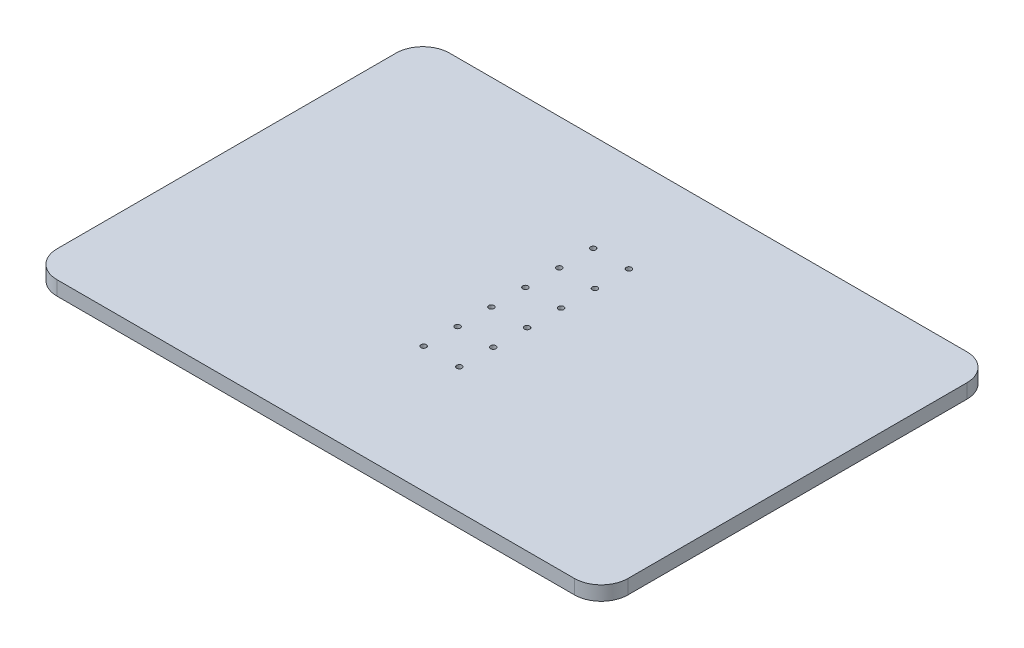
ISO-10303-21;
HEADER;
FILE_DESCRIPTION(('STEP AP214'),'2;1');
FILE_NAME('part.step','',(''),(''),'','','');
FILE_SCHEMA(('AUTOMOTIVE_DESIGN { 1 0 10303 214 1 1 1 1 }'));
ENDSEC;
DATA;
#1=APPLICATION_CONTEXT('core data for automotive mechanical design processes');
#2=APPLICATION_PROTOCOL_DEFINITION('international standard','automotive_design',2000,#1);
#3=PRODUCT_CONTEXT('',#1,'mechanical');
#4=PRODUCT('Part','Part','',(#3));
#5=PRODUCT_RELATED_PRODUCT_CATEGORY('part','',(#4));
#6=PRODUCT_DEFINITION_FORMATION('','',#4);
#7=PRODUCT_DEFINITION_CONTEXT('part definition',#1,'design');
#8=PRODUCT_DEFINITION('design','',#6,#7);
#9=PRODUCT_DEFINITION_SHAPE('','',#8);
#10=(LENGTH_UNIT() NAMED_UNIT(*) SI_UNIT(.MILLI.,.METRE.));
#11=(NAMED_UNIT(*) PLANE_ANGLE_UNIT() SI_UNIT($,.RADIAN.));
#12=(NAMED_UNIT(*) SI_UNIT($,.STERADIAN.) SOLID_ANGLE_UNIT());
#13=UNCERTAINTY_MEASURE_WITH_UNIT(LENGTH_MEASURE(1.E-05),#10,'distance_accuracy_value','');
#14=(GEOMETRIC_REPRESENTATION_CONTEXT(3) GLOBAL_UNCERTAINTY_ASSIGNED_CONTEXT((#13)) GLOBAL_UNIT_ASSIGNED_CONTEXT((#10,
#11,#12)) REPRESENTATION_CONTEXT('',''));
#15=CARTESIAN_POINT('',(0.,0.,0.));
#16=DIRECTION('',(0.,0.,1.));
#17=DIRECTION('',(1.,0.,0.));
#18=AXIS2_PLACEMENT_3D('',#15,#16,#17);
#19=CARTESIAN_POINT('',(-160.,8.,-110.));
#20=DIRECTION('',(1.,0.,0.));
#21=DIRECTION('',(0.,0.,-1.));
#22=AXIS2_PLACEMENT_3D('',#19,#20,#21);
#23=PLANE('',#22);
#24=DIRECTION('',(0.,0.,1.));
#25=VECTOR('',#24,1.);
#26=CARTESIAN_POINT('',(-160.,8.,-110.));
#27=LINE('',#26,#25);
#28=CARTESIAN_POINT('',(-160.,8.,-95.));
#29=VERTEX_POINT('',#28);
#30=CARTESIAN_POINT('',(-160.,8.,95.0000000000001));
#31=VERTEX_POINT('',#30);
#32=EDGE_CURVE('E117',#29,#31,#27,.T.);
#33=ORIENTED_EDGE('',*,*,#32,.F.);
#34=DIRECTION('',(0.,-1.,0.));
#35=VECTOR('',#34,1.);
#36=CARTESIAN_POINT('',(-160.,8.,-95.));
#37=LINE('',#36,#35);
#38=CARTESIAN_POINT('',(-160.,0.,-95.));
#39=VERTEX_POINT('',#38);
#40=EDGE_CURVE('E102',#29,#39,#37,.T.);
#41=ORIENTED_EDGE('',*,*,#40,.T.);
#42=DIRECTION('',(0.,0.,1.));
#43=VECTOR('',#42,1.);
#44=CARTESIAN_POINT('',(-160.,0.,-110.));
#45=LINE('',#44,#43);
#46=CARTESIAN_POINT('',(-160.,0.,95.0000000000001));
#47=VERTEX_POINT('',#46);
#48=EDGE_CURVE('E114',#39,#47,#45,.T.);
#49=ORIENTED_EDGE('',*,*,#48,.T.);
#50=DIRECTION('',(0.,-1.,0.));
#51=VECTOR('',#50,1.);
#52=CARTESIAN_POINT('',(-160.,8.,95.0000000000001));
#53=LINE('',#52,#51);
#54=EDGE_CURVE('E119',#47,#31,#53,.F.);
#55=ORIENTED_EDGE('',*,*,#54,.T.);
#56=EDGE_LOOP('',(#33,#41,#49,#55));
#57=FACE_BOUND('',#56,.T.);
#58=ADVANCED_FACE('F32',(#57),#23,.F.);
#59=CARTESIAN_POINT('',(160.,8.,110.));
#60=DIRECTION('',(0.,0.,-1.));
#61=DIRECTION('',(-1.,0.,0.));
#62=AXIS2_PLACEMENT_3D('',#59,#60,#61);
#63=PLANE('',#62);
#64=DIRECTION('',(1.,0.,0.));
#65=VECTOR('',#64,1.);
#66=CARTESIAN_POINT('',(160.,8.,110.));
#67=LINE('',#66,#65);
#68=CARTESIAN_POINT('',(-145.,8.,110.));
#69=VERTEX_POINT('',#68);
#70=CARTESIAN_POINT('',(145.,8.,110.));
#71=VERTEX_POINT('',#70);
#72=EDGE_CURVE('E163',#69,#71,#67,.T.);
#73=ORIENTED_EDGE('',*,*,#72,.F.);
#74=DIRECTION('',(0.,-1.,0.));
#75=VECTOR('',#74,1.);
#76=CARTESIAN_POINT('',(-145.,8.,110.));
#77=LINE('',#76,#75);
#78=CARTESIAN_POINT('',(-145.,0.,110.));
#79=VERTEX_POINT('',#78);
#80=EDGE_CURVE('E156',#69,#79,#77,.T.);
#81=ORIENTED_EDGE('',*,*,#80,.T.);
#82=DIRECTION('',(1.,0.,0.));
#83=VECTOR('',#82,1.);
#84=CARTESIAN_POINT('',(160.,0.,110.));
#85=LINE('',#84,#83);
#86=CARTESIAN_POINT('',(145.,0.,110.));
#87=VERTEX_POINT('',#86);
#88=EDGE_CURVE('E123',#79,#87,#85,.T.);
#89=ORIENTED_EDGE('',*,*,#88,.T.);
#90=DIRECTION('',(0.,-1.,0.));
#91=VECTOR('',#90,1.);
#92=CARTESIAN_POINT('',(145.,8.,110.));
#93=LINE('',#92,#91);
#94=EDGE_CURVE('E154',#87,#71,#93,.F.);
#95=ORIENTED_EDGE('',*,*,#94,.T.);
#96=EDGE_LOOP('',(#73,#81,#89,#95));
#97=FACE_BOUND('',#96,.T.);
#98=ADVANCED_FACE('F161',(#97),#63,.F.);
#99=CARTESIAN_POINT('',(160.,8.,-110.));
#100=DIRECTION('',(-1.,0.,0.));
#101=DIRECTION('',(0.,0.,1.));
#102=AXIS2_PLACEMENT_3D('',#99,#100,#101);
#103=PLANE('',#102);
#104=DIRECTION('',(0.,0.,-1.));
#105=VECTOR('',#104,1.);
#106=CARTESIAN_POINT('',(160.,8.,-110.));
#107=LINE('',#106,#105);
#108=CARTESIAN_POINT('',(160.,8.,95.));
#109=VERTEX_POINT('',#108);
#110=CARTESIAN_POINT('',(160.,8.,-95.));
#111=VERTEX_POINT('',#110);
#112=EDGE_CURVE('E171',#109,#111,#107,.T.);
#113=ORIENTED_EDGE('',*,*,#112,.F.);
#114=DIRECTION('',(0.,-1.,0.));
#115=VECTOR('',#114,1.);
#116=CARTESIAN_POINT('',(160.,8.,95.));
#117=LINE('',#116,#115);
#118=CARTESIAN_POINT('',(160.,0.,95.));
#119=VERTEX_POINT('',#118);
#120=EDGE_CURVE('E11',#109,#119,#117,.T.);
#121=ORIENTED_EDGE('',*,*,#120,.T.);
#122=DIRECTION('',(0.,0.,-1.));
#123=VECTOR('',#122,1.);
#124=CARTESIAN_POINT('',(160.,0.,-110.));
#125=LINE('',#124,#123);
#126=CARTESIAN_POINT('',(160.,0.,-95.));
#127=VERTEX_POINT('',#126);
#128=EDGE_CURVE('E127',#119,#127,#125,.T.);
#129=ORIENTED_EDGE('',*,*,#128,.T.);
#130=DIRECTION('',(0.,-1.,0.));
#131=VECTOR('',#130,1.);
#132=CARTESIAN_POINT('',(160.,8.,-95.));
#133=LINE('',#132,#131);
#134=EDGE_CURVE('E40',#127,#111,#133,.F.);
#135=ORIENTED_EDGE('',*,*,#134,.T.);
#136=EDGE_LOOP('',(#113,#121,#129,#135));
#137=FACE_BOUND('',#136,.T.);
#138=ADVANCED_FACE('F170',(#137),#103,.F.);
#139=CARTESIAN_POINT('',(160.,8.,-110.));
#140=DIRECTION('',(0.,0.,1.));
#141=DIRECTION('',(1.,0.,0.));
#142=AXIS2_PLACEMENT_3D('',#139,#140,#141);
#143=PLANE('',#142);
#144=DIRECTION('',(-1.,0.,0.));
#145=VECTOR('',#144,1.);
#146=CARTESIAN_POINT('',(160.,0.,-110.));
#147=LINE('',#146,#145);
#148=CARTESIAN_POINT('',(145.,0.,-110.));
#149=VERTEX_POINT('',#148);
#150=CARTESIAN_POINT('',(-145.,0.,-110.));
#151=VERTEX_POINT('',#150);
#152=EDGE_CURVE('E137',#149,#151,#147,.T.);
#153=ORIENTED_EDGE('',*,*,#152,.T.);
#154=DIRECTION('',(0.,-1.,0.));
#155=VECTOR('',#154,1.);
#156=CARTESIAN_POINT('',(-145.,8.,-110.));
#157=LINE('',#156,#155);
#158=CARTESIAN_POINT('',(-145.,8.,-110.));
#159=VERTEX_POINT('',#158);
#160=EDGE_CURVE('E103',#151,#159,#157,.F.);
#161=ORIENTED_EDGE('',*,*,#160,.T.);
#162=DIRECTION('',(-1.,0.,0.));
#163=VECTOR('',#162,1.);
#164=CARTESIAN_POINT('',(160.,8.,-110.));
#165=LINE('',#164,#163);
#166=CARTESIAN_POINT('',(145.,8.,-110.));
#167=VERTEX_POINT('',#166);
#168=EDGE_CURVE('E133',#167,#159,#165,.T.);
#169=ORIENTED_EDGE('',*,*,#168,.F.);
#170=DIRECTION('',(0.,-1.,0.));
#171=VECTOR('',#170,1.);
#172=CARTESIAN_POINT('',(145.,8.,-110.));
#173=LINE('',#172,#171);
#174=EDGE_CURVE('E108',#167,#149,#173,.T.);
#175=ORIENTED_EDGE('',*,*,#174,.T.);
#176=EDGE_LOOP('',(#153,#161,#169,#175));
#177=FACE_BOUND('',#176,.T.);
#178=ADVANCED_FACE('F283',(#177),#143,.F.);
#179=CARTESIAN_POINT('',(0.,8.,0.));
#180=DIRECTION('',(0.,-1.,0.));
#181=DIRECTION('',(0.,0.,-1.));
#182=AXIS2_PLACEMENT_3D('',#179,#180,#181);
#183=PLANE('',#182);
#184=CARTESIAN_POINT('',(10.,8.,-55.5));
#185=DIRECTION('',(0.,-1.,0.));
#186=DIRECTION('',(0.,0.,1.));
#187=AXIS2_PLACEMENT_3D('',#184,#185,#186);
#188=CIRCLE('',#187,1.5);
#189=CARTESIAN_POINT('',(10.,8.,-54.));
#190=VERTEX_POINT('',#189);
#191=EDGE_CURVE('E239',#190,#190,#188,.T.);
#192=ORIENTED_EDGE('',*,*,#191,.T.);
#193=EDGE_LOOP('',(#192));
#194=FACE_BOUND('',#193,.T.);
#195=CARTESIAN_POINT('',(10.,8.,-36.5));
#196=DIRECTION('',(0.,-1.,0.));
#197=DIRECTION('',(0.,0.,1.));
#198=AXIS2_PLACEMENT_3D('',#195,#196,#197);
#199=CIRCLE('',#198,1.5);
#200=CARTESIAN_POINT('',(10.,8.,-35.));
#201=VERTEX_POINT('',#200);
#202=EDGE_CURVE('E233',#201,#201,#199,.T.);
#203=ORIENTED_EDGE('',*,*,#202,.T.);
#204=EDGE_LOOP('',(#203));
#205=FACE_BOUND('',#204,.T.);
#206=CARTESIAN_POINT('',(10.,8.,-17.5));
#207=DIRECTION('',(0.,-1.,0.));
#208=DIRECTION('',(0.,0.,1.));
#209=AXIS2_PLACEMENT_3D('',#206,#207,#208);
#210=CIRCLE('',#209,1.5);
#211=CARTESIAN_POINT('',(10.,8.,-16.));
#212=VERTEX_POINT('',#211);
#213=EDGE_CURVE('E227',#212,#212,#210,.T.);
#214=ORIENTED_EDGE('',*,*,#213,.T.);
#215=EDGE_LOOP('',(#214));
#216=FACE_BOUND('',#215,.T.);
#217=CARTESIAN_POINT('',(10.,8.,39.5));
#218=DIRECTION('',(0.,-1.,0.));
#219=DIRECTION('',(0.,0.,1.));
#220=AXIS2_PLACEMENT_3D('',#217,#218,#219);
#221=CIRCLE('',#220,1.5);
#222=CARTESIAN_POINT('',(10.,8.,41.));
#223=VERTEX_POINT('',#222);
#224=EDGE_CURVE('E221',#223,#223,#221,.T.);
#225=ORIENTED_EDGE('',*,*,#224,.T.);
#226=EDGE_LOOP('',(#225));
#227=FACE_BOUND('',#226,.T.);
#228=CARTESIAN_POINT('',(10.,8.,20.5));
#229=DIRECTION('',(0.,-1.,0.));
#230=DIRECTION('',(0.,0.,1.));
#231=AXIS2_PLACEMENT_3D('',#228,#229,#230);
#232=CIRCLE('',#231,1.5);
#233=CARTESIAN_POINT('',(10.,8.,22.));
#234=VERTEX_POINT('',#233);
#235=EDGE_CURVE('E215',#234,#234,#232,.T.);
#236=ORIENTED_EDGE('',*,*,#235,.T.);
#237=EDGE_LOOP('',(#236));
#238=FACE_BOUND('',#237,.T.);
#239=CARTESIAN_POINT('',(10.,8.,1.5));
#240=DIRECTION('',(0.,-1.,0.));
#241=DIRECTION('',(0.,0.,1.));
#242=AXIS2_PLACEMENT_3D('',#239,#240,#241);
#243=CIRCLE('',#242,1.5);
#244=CARTESIAN_POINT('',(10.,8.,3.));
#245=VERTEX_POINT('',#244);
#246=EDGE_CURVE('E209',#245,#245,#243,.T.);
#247=ORIENTED_EDGE('',*,*,#246,.T.);
#248=EDGE_LOOP('',(#247));
#249=FACE_BOUND('',#248,.T.);
#250=CARTESIAN_POINT('',(-10.,8.,39.5));
#251=DIRECTION('',(0.,1.,0.));
#252=DIRECTION('',(0.,0.,1.));
#253=AXIS2_PLACEMENT_3D('',#250,#251,#252);
#254=CIRCLE('',#253,1.5);
#255=CARTESIAN_POINT('',(-10.,8.,41.));
#256=VERTEX_POINT('',#255);
#257=EDGE_CURVE('E203',#256,#256,#254,.T.);
#258=ORIENTED_EDGE('',*,*,#257,.F.);
#259=EDGE_LOOP('',(#258));
#260=FACE_BOUND('',#259,.T.);
#261=CARTESIAN_POINT('',(-10.,8.,20.5));
#262=DIRECTION('',(0.,1.,0.));
#263=DIRECTION('',(0.,0.,1.));
#264=AXIS2_PLACEMENT_3D('',#261,#262,#263);
#265=CIRCLE('',#264,1.5);
#266=CARTESIAN_POINT('',(-10.,8.,22.));
#267=VERTEX_POINT('',#266);
#268=EDGE_CURVE('E197',#267,#267,#265,.T.);
#269=ORIENTED_EDGE('',*,*,#268,.F.);
#270=EDGE_LOOP('',(#269));
#271=FACE_BOUND('',#270,.T.);
#272=CARTESIAN_POINT('',(-10.,8.,-55.5));
#273=DIRECTION('',(0.,1.,0.));
#274=DIRECTION('',(0.,0.,1.));
#275=AXIS2_PLACEMENT_3D('',#272,#273,#274);
#276=CIRCLE('',#275,1.5);
#277=CARTESIAN_POINT('',(-10.,8.,-54.));
#278=VERTEX_POINT('',#277);
#279=EDGE_CURVE('E191',#278,#278,#276,.T.);
#280=ORIENTED_EDGE('',*,*,#279,.F.);
#281=EDGE_LOOP('',(#280));
#282=FACE_BOUND('',#281,.T.);
#283=CARTESIAN_POINT('',(-10.,8.,-36.5));
#284=DIRECTION('',(0.,1.,0.));
#285=DIRECTION('',(0.,0.,1.));
#286=AXIS2_PLACEMENT_3D('',#283,#284,#285);
#287=CIRCLE('',#286,1.5);
#288=CARTESIAN_POINT('',(-10.,8.,-35.));
#289=VERTEX_POINT('',#288);
#290=EDGE_CURVE('E185',#289,#289,#287,.T.);
#291=ORIENTED_EDGE('',*,*,#290,.F.);
#292=EDGE_LOOP('',(#291));
#293=FACE_BOUND('',#292,.T.);
#294=CARTESIAN_POINT('',(-10.,8.,-17.5));
#295=DIRECTION('',(0.,1.,0.));
#296=DIRECTION('',(0.,0.,1.));
#297=AXIS2_PLACEMENT_3D('',#294,#295,#296);
#298=CIRCLE('',#297,1.5);
#299=CARTESIAN_POINT('',(-10.,8.,-16.));
#300=VERTEX_POINT('',#299);
#301=EDGE_CURVE('E178',#300,#300,#298,.T.);
#302=ORIENTED_EDGE('',*,*,#301,.F.);
#303=EDGE_LOOP('',(#302));
#304=FACE_BOUND('',#303,.T.);
#305=CARTESIAN_POINT('',(-10.,8.,1.5));
#306=DIRECTION('',(0.,1.,0.));
#307=DIRECTION('',(0.,0.,1.));
#308=AXIS2_PLACEMENT_3D('',#305,#306,#307);
#309=CIRCLE('',#308,1.5);
#310=CARTESIAN_POINT('',(-10.,8.,3.));
#311=VERTEX_POINT('',#310);
#312=EDGE_CURVE('E124',#311,#311,#309,.T.);
#313=ORIENTED_EDGE('',*,*,#312,.F.);
#314=EDGE_LOOP('',(#313));
#315=FACE_BOUND('',#314,.T.);
#316=ORIENTED_EDGE('',*,*,#168,.T.);
#317=CARTESIAN_POINT('',(-145.,8.,-95.));
#318=DIRECTION('',(0.,-1.,0.));
#319=DIRECTION('',(0.,0.,-1.));
#320=AXIS2_PLACEMENT_3D('',#317,#318,#319);
#321=CIRCLE('',#320,15.);
#322=EDGE_CURVE('E152',#159,#29,#321,.F.);
#323=ORIENTED_EDGE('',*,*,#322,.T.);
#324=ORIENTED_EDGE('',*,*,#32,.T.);
#325=CARTESIAN_POINT('',(-145.,8.,95.));
#326=DIRECTION('',(0.,-1.,0.));
#327=DIRECTION('',(0.,0.,-1.));
#328=AXIS2_PLACEMENT_3D('',#325,#326,#327);
#329=CIRCLE('',#328,15.);
#330=EDGE_CURVE('E150',#31,#69,#329,.F.);
#331=ORIENTED_EDGE('',*,*,#330,.T.);
#332=ORIENTED_EDGE('',*,*,#72,.T.);
#333=CARTESIAN_POINT('',(145.,8.,95.));
#334=DIRECTION('',(0.,-1.,0.));
#335=DIRECTION('',(0.,0.,-1.));
#336=AXIS2_PLACEMENT_3D('',#333,#334,#335);
#337=CIRCLE('',#336,15.);
#338=EDGE_CURVE('E53',#71,#109,#337,.F.);
#339=ORIENTED_EDGE('',*,*,#338,.T.);
#340=ORIENTED_EDGE('',*,*,#112,.T.);
#341=CARTESIAN_POINT('',(145.,8.,-95.));
#342=DIRECTION('',(0.,-1.,0.));
#343=DIRECTION('',(0.,0.,-1.));
#344=AXIS2_PLACEMENT_3D('',#341,#342,#343);
#345=CIRCLE('',#344,15.);
#346=EDGE_CURVE('E147',#111,#167,#345,.F.);
#347=ORIENTED_EDGE('',*,*,#346,.T.);
#348=EDGE_LOOP('',(#316,#323,#324,#331,#332,#339,#340,#347));
#349=FACE_BOUND('',#348,.T.);
#350=ADVANCED_FACE('F251',(#194,#205,#216,#227,#238,#249,#260,#271,#282,#293,#304,#315,#349),
#183,.F.);
#351=CARTESIAN_POINT('',(0.,0.,0.));
#352=DIRECTION('',(0.,-1.,0.));
#353=DIRECTION('',(0.,0.,-1.));
#354=AXIS2_PLACEMENT_3D('',#351,#352,#353);
#355=PLANE('',#354);
#356=CARTESIAN_POINT('',(10.,0.,-55.5));
#357=DIRECTION('',(0.,1.,0.));
#358=DIRECTION('',(0.,0.,-1.));
#359=AXIS2_PLACEMENT_3D('',#356,#357,#358);
#360=CIRCLE('',#359,1.5);
#361=CARTESIAN_POINT('',(10.,0.,-57.));
#362=VERTEX_POINT('',#361);
#363=EDGE_CURVE('E242',#362,#362,#360,.F.);
#364=ORIENTED_EDGE('',*,*,#363,.F.);
#365=EDGE_LOOP('',(#364));
#366=FACE_BOUND('',#365,.T.);
#367=CARTESIAN_POINT('',(10.,0.,-36.5));
#368=DIRECTION('',(0.,1.,0.));
#369=DIRECTION('',(0.,0.,-1.));
#370=AXIS2_PLACEMENT_3D('',#367,#368,#369);
#371=CIRCLE('',#370,1.5);
#372=CARTESIAN_POINT('',(10.,0.,-38.));
#373=VERTEX_POINT('',#372);
#374=EDGE_CURVE('E236',#373,#373,#371,.F.);
#375=ORIENTED_EDGE('',*,*,#374,.F.);
#376=EDGE_LOOP('',(#375));
#377=FACE_BOUND('',#376,.T.);
#378=CARTESIAN_POINT('',(10.,0.,-17.5));
#379=DIRECTION('',(0.,1.,0.));
#380=DIRECTION('',(0.,0.,-1.));
#381=AXIS2_PLACEMENT_3D('',#378,#379,#380);
#382=CIRCLE('',#381,1.5);
#383=CARTESIAN_POINT('',(10.,0.,-19.));
#384=VERTEX_POINT('',#383);
#385=EDGE_CURVE('E230',#384,#384,#382,.F.);
#386=ORIENTED_EDGE('',*,*,#385,.F.);
#387=EDGE_LOOP('',(#386));
#388=FACE_BOUND('',#387,.T.);
#389=CARTESIAN_POINT('',(10.,0.,39.5));
#390=DIRECTION('',(0.,1.,0.));
#391=DIRECTION('',(0.,0.,-1.));
#392=AXIS2_PLACEMENT_3D('',#389,#390,#391);
#393=CIRCLE('',#392,1.5);
#394=CARTESIAN_POINT('',(10.,0.,38.));
#395=VERTEX_POINT('',#394);
#396=EDGE_CURVE('E224',#395,#395,#393,.F.);
#397=ORIENTED_EDGE('',*,*,#396,.F.);
#398=EDGE_LOOP('',(#397));
#399=FACE_BOUND('',#398,.T.);
#400=CARTESIAN_POINT('',(10.,0.,20.5));
#401=DIRECTION('',(0.,1.,0.));
#402=DIRECTION('',(0.,0.,-1.));
#403=AXIS2_PLACEMENT_3D('',#400,#401,#402);
#404=CIRCLE('',#403,1.5);
#405=CARTESIAN_POINT('',(10.,0.,19.));
#406=VERTEX_POINT('',#405);
#407=EDGE_CURVE('E218',#406,#406,#404,.F.);
#408=ORIENTED_EDGE('',*,*,#407,.F.);
#409=EDGE_LOOP('',(#408));
#410=FACE_BOUND('',#409,.T.);
#411=CARTESIAN_POINT('',(10.,0.,1.5));
#412=DIRECTION('',(0.,1.,0.));
#413=DIRECTION('',(0.,0.,-1.));
#414=AXIS2_PLACEMENT_3D('',#411,#412,#413);
#415=CIRCLE('',#414,1.5);
#416=CARTESIAN_POINT('',(10.,0.,0.));
#417=VERTEX_POINT('',#416);
#418=EDGE_CURVE('E212',#417,#417,#415,.F.);
#419=ORIENTED_EDGE('',*,*,#418,.F.);
#420=EDGE_LOOP('',(#419));
#421=FACE_BOUND('',#420,.T.);
#422=CARTESIAN_POINT('',(-10.,0.,39.5));
#423=DIRECTION('',(0.,-1.,0.));
#424=DIRECTION('',(0.,0.,-1.));
#425=AXIS2_PLACEMENT_3D('',#422,#423,#424);
#426=CIRCLE('',#425,1.5);
#427=CARTESIAN_POINT('',(-10.,0.,38.));
#428=VERTEX_POINT('',#427);
#429=EDGE_CURVE('E206',#428,#428,#426,.F.);
#430=ORIENTED_EDGE('',*,*,#429,.T.);
#431=EDGE_LOOP('',(#430));
#432=FACE_BOUND('',#431,.T.);
#433=CARTESIAN_POINT('',(-10.,0.,20.5));
#434=DIRECTION('',(0.,-1.,0.));
#435=DIRECTION('',(0.,0.,-1.));
#436=AXIS2_PLACEMENT_3D('',#433,#434,#435);
#437=CIRCLE('',#436,1.5);
#438=CARTESIAN_POINT('',(-10.,0.,19.));
#439=VERTEX_POINT('',#438);
#440=EDGE_CURVE('E200',#439,#439,#437,.F.);
#441=ORIENTED_EDGE('',*,*,#440,.T.);
#442=EDGE_LOOP('',(#441));
#443=FACE_BOUND('',#442,.T.);
#444=CARTESIAN_POINT('',(-10.,0.,-55.5));
#445=DIRECTION('',(0.,-1.,0.));
#446=DIRECTION('',(0.,0.,-1.));
#447=AXIS2_PLACEMENT_3D('',#444,#445,#446);
#448=CIRCLE('',#447,1.5);
#449=CARTESIAN_POINT('',(-10.,0.,-57.));
#450=VERTEX_POINT('',#449);
#451=EDGE_CURVE('E194',#450,#450,#448,.F.);
#452=ORIENTED_EDGE('',*,*,#451,.T.);
#453=EDGE_LOOP('',(#452));
#454=FACE_BOUND('',#453,.T.);
#455=CARTESIAN_POINT('',(-10.,0.,-36.5));
#456=DIRECTION('',(0.,-1.,0.));
#457=DIRECTION('',(0.,0.,-1.));
#458=AXIS2_PLACEMENT_3D('',#455,#456,#457);
#459=CIRCLE('',#458,1.5);
#460=CARTESIAN_POINT('',(-10.,0.,-38.));
#461=VERTEX_POINT('',#460);
#462=EDGE_CURVE('E188',#461,#461,#459,.F.);
#463=ORIENTED_EDGE('',*,*,#462,.T.);
#464=EDGE_LOOP('',(#463));
#465=FACE_BOUND('',#464,.T.);
#466=CARTESIAN_POINT('',(-10.,0.,-17.5));
#467=DIRECTION('',(0.,-1.,0.));
#468=DIRECTION('',(0.,0.,-1.));
#469=AXIS2_PLACEMENT_3D('',#466,#467,#468);
#470=CIRCLE('',#469,1.5);
#471=CARTESIAN_POINT('',(-10.,0.,-19.));
#472=VERTEX_POINT('',#471);
#473=EDGE_CURVE('E182',#472,#472,#470,.F.);
#474=ORIENTED_EDGE('',*,*,#473,.T.);
#475=EDGE_LOOP('',(#474));
#476=FACE_BOUND('',#475,.T.);
#477=CARTESIAN_POINT('',(-10.,0.,1.5));
#478=DIRECTION('',(0.,-1.,0.));
#479=DIRECTION('',(0.,0.,-1.));
#480=AXIS2_PLACEMENT_3D('',#477,#478,#479);
#481=CIRCLE('',#480,1.5);
#482=CARTESIAN_POINT('',(-10.,0.,0.));
#483=VERTEX_POINT('',#482);
#484=EDGE_CURVE('E130',#483,#483,#481,.F.);
#485=ORIENTED_EDGE('',*,*,#484,.T.);
#486=EDGE_LOOP('',(#485));
#487=FACE_BOUND('',#486,.T.);
#488=ORIENTED_EDGE('',*,*,#48,.F.);
#489=CARTESIAN_POINT('',(-145.,0.,-95.));
#490=DIRECTION('',(0.,-1.,0.));
#491=DIRECTION('',(0.,0.,-1.));
#492=AXIS2_PLACEMENT_3D('',#489,#490,#491);
#493=CIRCLE('',#492,15.);
#494=EDGE_CURVE('E98',#39,#151,#493,.T.);
#495=ORIENTED_EDGE('',*,*,#494,.T.);
#496=ORIENTED_EDGE('',*,*,#152,.F.);
#497=CARTESIAN_POINT('',(145.,0.,-95.));
#498=DIRECTION('',(0.,-1.,0.));
#499=DIRECTION('',(0.,0.,-1.));
#500=AXIS2_PLACEMENT_3D('',#497,#498,#499);
#501=CIRCLE('',#500,15.);
#502=EDGE_CURVE('E118',#149,#127,#501,.T.);
#503=ORIENTED_EDGE('',*,*,#502,.T.);
#504=ORIENTED_EDGE('',*,*,#128,.F.);
#505=CARTESIAN_POINT('',(145.,0.,95.));
#506=DIRECTION('',(0.,-1.,0.));
#507=DIRECTION('',(0.,0.,-1.));
#508=AXIS2_PLACEMENT_3D('',#505,#506,#507);
#509=CIRCLE('',#508,15.);
#510=EDGE_CURVE('E141',#119,#87,#509,.T.);
#511=ORIENTED_EDGE('',*,*,#510,.T.);
#512=ORIENTED_EDGE('',*,*,#88,.F.);
#513=CARTESIAN_POINT('',(-145.,0.,95.));
#514=DIRECTION('',(0.,-1.,0.));
#515=DIRECTION('',(0.,0.,-1.));
#516=AXIS2_PLACEMENT_3D('',#513,#514,#515);
#517=CIRCLE('',#516,15.);
#518=EDGE_CURVE('E109',#79,#47,#517,.T.);
#519=ORIENTED_EDGE('',*,*,#518,.T.);
#520=EDGE_LOOP('',(#488,#495,#496,#503,#504,#511,#512,#519));
#521=FACE_BOUND('',#520,.T.);
#522=ADVANCED_FACE('F121',(#366,#377,#388,#399,#410,#421,#432,#443,#454,#465,#476,#487,#521),
#355,.T.);
#523=CARTESIAN_POINT('',(-145.,8.,-95.));
#524=DIRECTION('',(0.,-1.,0.));
#525=DIRECTION('',(0.,0.,-1.));
#526=AXIS2_PLACEMENT_3D('',#523,#524,#525);
#527=CYLINDRICAL_SURFACE('',#526,15.);
#528=ORIENTED_EDGE('',*,*,#322,.F.);
#529=ORIENTED_EDGE('',*,*,#160,.F.);
#530=ORIENTED_EDGE('',*,*,#494,.F.);
#531=ORIENTED_EDGE('',*,*,#40,.F.);
#532=EDGE_LOOP('',(#528,#529,#530,#531));
#533=FACE_BOUND('',#532,.T.);
#534=ADVANCED_FACE('F101',(#533),#527,.T.);
#535=CARTESIAN_POINT('',(-145.,8.,95.));
#536=DIRECTION('',(0.,-1.,0.));
#537=DIRECTION('',(0.,0.,-1.));
#538=AXIS2_PLACEMENT_3D('',#535,#536,#537);
#539=CYLINDRICAL_SURFACE('',#538,15.);
#540=ORIENTED_EDGE('',*,*,#330,.F.);
#541=ORIENTED_EDGE('',*,*,#54,.F.);
#542=ORIENTED_EDGE('',*,*,#518,.F.);
#543=ORIENTED_EDGE('',*,*,#80,.F.);
#544=EDGE_LOOP('',(#540,#541,#542,#543));
#545=FACE_BOUND('',#544,.T.);
#546=ADVANCED_FACE('F294',(#545),#539,.T.);
#547=CARTESIAN_POINT('',(145.,8.,95.));
#548=DIRECTION('',(0.,-1.,0.));
#549=DIRECTION('',(0.,0.,-1.));
#550=AXIS2_PLACEMENT_3D('',#547,#548,#549);
#551=CYLINDRICAL_SURFACE('',#550,15.);
#552=ORIENTED_EDGE('',*,*,#338,.F.);
#553=ORIENTED_EDGE('',*,*,#94,.F.);
#554=ORIENTED_EDGE('',*,*,#510,.F.);
#555=ORIENTED_EDGE('',*,*,#120,.F.);
#556=EDGE_LOOP('',(#552,#553,#554,#555));
#557=FACE_BOUND('',#556,.T.);
#558=ADVANCED_FACE('F169',(#557),#551,.T.);
#559=CARTESIAN_POINT('',(145.,8.,-95.));
#560=DIRECTION('',(0.,-1.,0.));
#561=DIRECTION('',(0.,0.,-1.));
#562=AXIS2_PLACEMENT_3D('',#559,#560,#561);
#563=CYLINDRICAL_SURFACE('',#562,15.);
#564=ORIENTED_EDGE('',*,*,#346,.F.);
#565=ORIENTED_EDGE('',*,*,#134,.F.);
#566=ORIENTED_EDGE('',*,*,#502,.F.);
#567=ORIENTED_EDGE('',*,*,#174,.F.);
#568=EDGE_LOOP('',(#564,#565,#566,#567));
#569=FACE_BOUND('',#568,.T.);
#570=ADVANCED_FACE('F34',(#569),#563,.T.);
#571=CARTESIAN_POINT('',(-10.,-0.000999999999999265,1.5));
#572=DIRECTION('',(0.,1.,0.));
#573=DIRECTION('',(0.,0.,1.));
#574=AXIS2_PLACEMENT_3D('',#571,#572,#573);
#575=CYLINDRICAL_SURFACE('',#574,1.5);
#576=ORIENTED_EDGE('',*,*,#484,.F.);
#577=EDGE_LOOP('',(#576));
#578=FACE_BOUND('',#577,.T.);
#579=ORIENTED_EDGE('',*,*,#312,.T.);
#580=EDGE_LOOP('',(#579));
#581=FACE_BOUND('',#580,.T.);
#582=ADVANCED_FACE('F275',(#578,#581),#575,.F.);
#583=CARTESIAN_POINT('',(-10.,-0.000999999999999265,-17.5));
#584=DIRECTION('',(0.,1.,0.));
#585=DIRECTION('',(0.,0.,1.));
#586=AXIS2_PLACEMENT_3D('',#583,#584,#585);
#587=CYLINDRICAL_SURFACE('',#586,1.5);
#588=ORIENTED_EDGE('',*,*,#473,.F.);
#589=EDGE_LOOP('',(#588));
#590=FACE_BOUND('',#589,.T.);
#591=ORIENTED_EDGE('',*,*,#301,.T.);
#592=EDGE_LOOP('',(#591));
#593=FACE_BOUND('',#592,.T.);
#594=ADVANCED_FACE('F278',(#590,#593),#587,.F.);
#595=CARTESIAN_POINT('',(-10.,-0.000999999999999265,-36.5));
#596=DIRECTION('',(0.,1.,0.));
#597=DIRECTION('',(0.,0.,1.));
#598=AXIS2_PLACEMENT_3D('',#595,#596,#597);
#599=CYLINDRICAL_SURFACE('',#598,1.5);
#600=ORIENTED_EDGE('',*,*,#462,.F.);
#601=EDGE_LOOP('',(#600));
#602=FACE_BOUND('',#601,.T.);
#603=ORIENTED_EDGE('',*,*,#290,.T.);
#604=EDGE_LOOP('',(#603));
#605=FACE_BOUND('',#604,.T.);
#606=ADVANCED_FACE('F333',(#602,#605),#599,.F.);
#607=CARTESIAN_POINT('',(-10.,-0.000999999999999265,-55.5));
#608=DIRECTION('',(0.,1.,0.));
#609=DIRECTION('',(0.,0.,1.));
#610=AXIS2_PLACEMENT_3D('',#607,#608,#609);
#611=CYLINDRICAL_SURFACE('',#610,1.5);
#612=ORIENTED_EDGE('',*,*,#451,.F.);
#613=EDGE_LOOP('',(#612));
#614=FACE_BOUND('',#613,.T.);
#615=ORIENTED_EDGE('',*,*,#279,.T.);
#616=EDGE_LOOP('',(#615));
#617=FACE_BOUND('',#616,.T.);
#618=ADVANCED_FACE('F343',(#614,#617),#611,.F.);
#619=CARTESIAN_POINT('',(-10.,-0.000999999999999265,20.5));
#620=DIRECTION('',(0.,1.,0.));
#621=DIRECTION('',(0.,0.,1.));
#622=AXIS2_PLACEMENT_3D('',#619,#620,#621);
#623=CYLINDRICAL_SURFACE('',#622,1.5);
#624=ORIENTED_EDGE('',*,*,#440,.F.);
#625=EDGE_LOOP('',(#624));
#626=FACE_BOUND('',#625,.T.);
#627=ORIENTED_EDGE('',*,*,#268,.T.);
#628=EDGE_LOOP('',(#627));
#629=FACE_BOUND('',#628,.T.);
#630=ADVANCED_FACE('F353',(#626,#629),#623,.F.);
#631=CARTESIAN_POINT('',(-10.,-0.000999999999999265,39.5));
#632=DIRECTION('',(0.,1.,0.));
#633=DIRECTION('',(0.,0.,1.));
#634=AXIS2_PLACEMENT_3D('',#631,#632,#633);
#635=CYLINDRICAL_SURFACE('',#634,1.5);
#636=ORIENTED_EDGE('',*,*,#429,.F.);
#637=EDGE_LOOP('',(#636));
#638=FACE_BOUND('',#637,.T.);
#639=ORIENTED_EDGE('',*,*,#257,.T.);
#640=EDGE_LOOP('',(#639));
#641=FACE_BOUND('',#640,.T.);
#642=ADVANCED_FACE('F363',(#638,#641),#635,.F.);
#643=CARTESIAN_POINT('',(10.,-0.000999999999999265,1.5));
#644=DIRECTION('',(0.,1.,0.));
#645=DIRECTION('',(0.,0.,1.));
#646=AXIS2_PLACEMENT_3D('',#643,#644,#645);
#647=CYLINDRICAL_SURFACE('',#646,1.5);
#648=ORIENTED_EDGE('',*,*,#418,.T.);
#649=EDGE_LOOP('',(#648));
#650=FACE_BOUND('',#649,.T.);
#651=ORIENTED_EDGE('',*,*,#246,.F.);
#652=EDGE_LOOP('',(#651));
#653=FACE_BOUND('',#652,.T.);
#654=ADVANCED_FACE('F373',(#650,#653),#647,.F.);
#655=CARTESIAN_POINT('',(10.,-0.000999999999999265,20.5));
#656=DIRECTION('',(0.,1.,0.));
#657=DIRECTION('',(0.,0.,1.));
#658=AXIS2_PLACEMENT_3D('',#655,#656,#657);
#659=CYLINDRICAL_SURFACE('',#658,1.5);
#660=ORIENTED_EDGE('',*,*,#407,.T.);
#661=EDGE_LOOP('',(#660));
#662=FACE_BOUND('',#661,.T.);
#663=ORIENTED_EDGE('',*,*,#235,.F.);
#664=EDGE_LOOP('',(#663));
#665=FACE_BOUND('',#664,.T.);
#666=ADVANCED_FACE('F398',(#662,#665),#659,.F.);
#667=CARTESIAN_POINT('',(10.,-0.000999999999999265,39.5));
#668=DIRECTION('',(0.,1.,0.));
#669=DIRECTION('',(0.,0.,1.));
#670=AXIS2_PLACEMENT_3D('',#667,#668,#669);
#671=CYLINDRICAL_SURFACE('',#670,1.5);
#672=ORIENTED_EDGE('',*,*,#396,.T.);
#673=EDGE_LOOP('',(#672));
#674=FACE_BOUND('',#673,.T.);
#675=ORIENTED_EDGE('',*,*,#224,.F.);
#676=EDGE_LOOP('',(#675));
#677=FACE_BOUND('',#676,.T.);
#678=ADVANCED_FACE('F408',(#674,#677),#671,.F.);
#679=CARTESIAN_POINT('',(10.,-0.000999999999999265,-17.5));
#680=DIRECTION('',(0.,1.,0.));
#681=DIRECTION('',(0.,0.,1.));
#682=AXIS2_PLACEMENT_3D('',#679,#680,#681);
#683=CYLINDRICAL_SURFACE('',#682,1.5);
#684=ORIENTED_EDGE('',*,*,#385,.T.);
#685=EDGE_LOOP('',(#684));
#686=FACE_BOUND('',#685,.T.);
#687=ORIENTED_EDGE('',*,*,#213,.F.);
#688=EDGE_LOOP('',(#687));
#689=FACE_BOUND('',#688,.T.);
#690=ADVANCED_FACE('F418',(#686,#689),#683,.F.);
#691=CARTESIAN_POINT('',(10.,-0.000999999999999265,-36.5));
#692=DIRECTION('',(0.,1.,0.));
#693=DIRECTION('',(0.,0.,1.));
#694=AXIS2_PLACEMENT_3D('',#691,#692,#693);
#695=CYLINDRICAL_SURFACE('',#694,1.5);
#696=ORIENTED_EDGE('',*,*,#374,.T.);
#697=EDGE_LOOP('',(#696));
#698=FACE_BOUND('',#697,.T.);
#699=ORIENTED_EDGE('',*,*,#202,.F.);
#700=EDGE_LOOP('',(#699));
#701=FACE_BOUND('',#700,.T.);
#702=ADVANCED_FACE('F428',(#698,#701),#695,.F.);
#703=CARTESIAN_POINT('',(10.,-0.000999999999999265,-55.5));
#704=DIRECTION('',(0.,1.,0.));
#705=DIRECTION('',(0.,0.,1.));
#706=AXIS2_PLACEMENT_3D('',#703,#704,#705);
#707=CYLINDRICAL_SURFACE('',#706,1.5);
#708=ORIENTED_EDGE('',*,*,#363,.T.);
#709=EDGE_LOOP('',(#708));
#710=FACE_BOUND('',#709,.T.);
#711=ORIENTED_EDGE('',*,*,#191,.F.);
#712=EDGE_LOOP('',(#711));
#713=FACE_BOUND('',#712,.T.);
#714=ADVANCED_FACE('F246',(#710,#713),#707,.F.);
#715=CLOSED_SHELL('',(#58,#98,#138,#178,#350,#522,#534,#546,#558,#570,#582,#594,#606,#618,#630,
#642,#654,#666,#678,#690,#702,#714));
#716=MANIFOLD_SOLID_BREP('B2',#715);
#717=ADVANCED_BREP_SHAPE_REPRESENTATION('',(#18,#716),#14);
#718=SHAPE_DEFINITION_REPRESENTATION(#9,#717);
ENDSEC;
END-ISO-10303-21;
